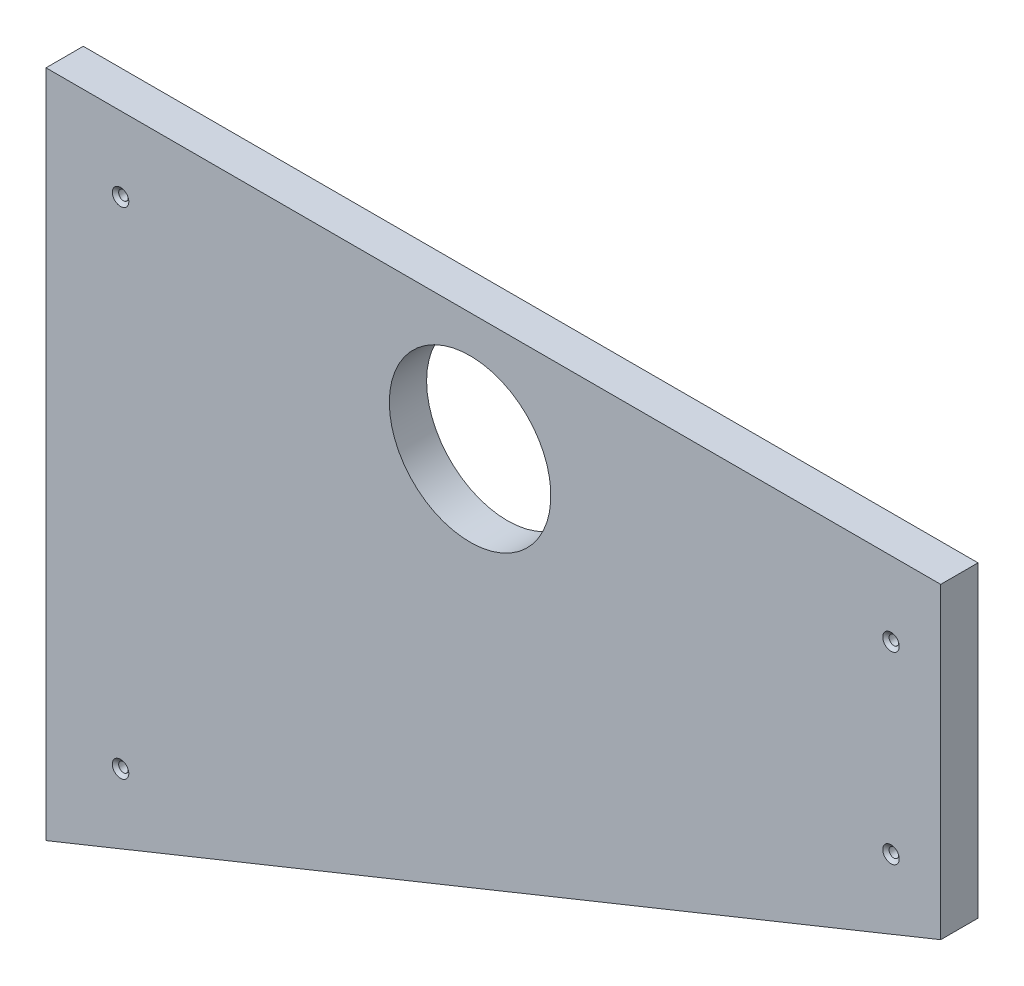
ISO-10303-21;
HEADER;
FILE_DESCRIPTION(('STEP AP214'),'2;1');
FILE_NAME('part.step','',(''),(''),'','','');
FILE_SCHEMA(('AUTOMOTIVE_DESIGN { 1 0 10303 214 1 1 1 1 }'));
ENDSEC;
DATA;
#1=APPLICATION_CONTEXT('core data for automotive mechanical design processes');
#2=APPLICATION_PROTOCOL_DEFINITION('international standard','automotive_design',2000,#1);
#3=PRODUCT_CONTEXT('',#1,'mechanical');
#4=PRODUCT('Part','Part','',(#3));
#5=PRODUCT_RELATED_PRODUCT_CATEGORY('part','',(#4));
#6=PRODUCT_DEFINITION_FORMATION('','',#4);
#7=PRODUCT_DEFINITION_CONTEXT('part definition',#1,'design');
#8=PRODUCT_DEFINITION('design','',#6,#7);
#9=PRODUCT_DEFINITION_SHAPE('','',#8);
#10=(LENGTH_UNIT() NAMED_UNIT(*) SI_UNIT(.MILLI.,.METRE.));
#11=(NAMED_UNIT(*) PLANE_ANGLE_UNIT() SI_UNIT($,.RADIAN.));
#12=(NAMED_UNIT(*) SI_UNIT($,.STERADIAN.) SOLID_ANGLE_UNIT());
#13=UNCERTAINTY_MEASURE_WITH_UNIT(LENGTH_MEASURE(1.E-05),#10,'distance_accuracy_value','');
#14=(GEOMETRIC_REPRESENTATION_CONTEXT(3) GLOBAL_UNCERTAINTY_ASSIGNED_CONTEXT((#13)) GLOBAL_UNIT_ASSIGNED_CONTEXT((#10,
#11,#12)) REPRESENTATION_CONTEXT('',''));
#15=CARTESIAN_POINT('',(0.,0.,0.));
#16=DIRECTION('',(0.,0.,1.));
#17=DIRECTION('',(1.,0.,0.));
#18=AXIS2_PLACEMENT_3D('',#15,#16,#17);
#19=CARTESIAN_POINT('',(3140.70999999981,6983.72999014018,-19.05));
#20=DIRECTION('',(0.,-1.,0.));
#21=DIRECTION('',(1.,0.,0.));
#22=AXIS2_PLACEMENT_3D('',#19,#20,#21);
#23=PLANE('',#22);
#24=DIRECTION('',(-1.,0.,0.));
#25=VECTOR('',#24,1.);
#26=CARTESIAN_POINT('',(3140.70999999981,6983.72999014018,0.));
#27=LINE('',#26,#25);
#28=CARTESIAN_POINT('',(3140.70999999981,6983.72999014018,0.));
#29=VERTEX_POINT('',#28);
#30=CARTESIAN_POINT('',(2683.50999999981,6983.72999014018,0.));
#31=VERTEX_POINT('',#30);
#32=EDGE_CURVE('E103',#29,#31,#27,.T.);
#33=ORIENTED_EDGE('',*,*,#32,.F.);
#34=DIRECTION('',(0.,0.,1.));
#35=VECTOR('',#34,1.);
#36=CARTESIAN_POINT('',(3140.70999999981,6983.72999014018,-19.05));
#37=LINE('',#36,#35);
#38=CARTESIAN_POINT('',(3140.70999999981,6983.72999014018,-19.05));
#39=VERTEX_POINT('',#38);
#40=EDGE_CURVE('E102',#39,#29,#37,.T.);
#41=ORIENTED_EDGE('',*,*,#40,.F.);
#42=DIRECTION('',(-1.,0.,0.));
#43=VECTOR('',#42,1.);
#44=CARTESIAN_POINT('',(3140.70999999981,6983.72999014018,-19.05));
#45=LINE('',#44,#43);
#46=CARTESIAN_POINT('',(2683.50999999981,6983.72999014018,-19.05));
#47=VERTEX_POINT('',#46);
#48=EDGE_CURVE('E96',#39,#47,#45,.T.);
#49=ORIENTED_EDGE('',*,*,#48,.T.);
#50=DIRECTION('',(0.,0.,1.));
#51=VECTOR('',#50,1.);
#52=CARTESIAN_POINT('',(2683.50999999981,6983.72999014018,-19.05));
#53=LINE('',#52,#51);
#54=EDGE_CURVE('E11',#47,#31,#53,.T.);
#55=ORIENTED_EDGE('',*,*,#54,.T.);
#56=EDGE_LOOP('',(#33,#41,#49,#55));
#57=FACE_BOUND('',#56,.T.);
#58=ADVANCED_FACE('F39',(#57),#23,.F.);
#59=CARTESIAN_POINT('',(2683.50999999981,6983.72999014018,-19.05));
#60=DIRECTION('',(1.,0.,0.));
#61=DIRECTION('',(0.,0.,1.));
#62=AXIS2_PLACEMENT_3D('',#59,#60,#61);
#63=PLANE('',#62);
#64=DIRECTION('',(0.,-1.,0.));
#65=VECTOR('',#64,1.);
#66=CARTESIAN_POINT('',(2683.50999999981,6983.72999014018,0.));
#67=LINE('',#66,#65);
#68=CARTESIAN_POINT('',(2683.50999999981,6641.74188684795,0.));
#69=VERTEX_POINT('',#68);
#70=EDGE_CURVE('E105',#31,#69,#67,.T.);
#71=ORIENTED_EDGE('',*,*,#70,.F.);
#72=ORIENTED_EDGE('',*,*,#54,.F.);
#73=DIRECTION('',(0.,-1.,0.));
#74=VECTOR('',#73,1.);
#75=CARTESIAN_POINT('',(2683.50999999981,6983.72999014018,-19.05));
#76=LINE('',#75,#74);
#77=CARTESIAN_POINT('',(2683.50999999981,6641.74188684795,-19.05));
#78=VERTEX_POINT('',#77);
#79=EDGE_CURVE('E80',#47,#78,#76,.T.);
#80=ORIENTED_EDGE('',*,*,#79,.T.);
#81=DIRECTION('',(0.,0.,1.));
#82=VECTOR('',#81,1.);
#83=CARTESIAN_POINT('',(2683.50999999981,6641.74188684795,-19.05));
#84=LINE('',#83,#82);
#85=EDGE_CURVE('E47',#78,#69,#84,.T.);
#86=ORIENTED_EDGE('',*,*,#85,.T.);
#87=EDGE_LOOP('',(#71,#72,#80,#86));
#88=FACE_BOUND('',#87,.T.);
#89=ADVANCED_FACE('F94',(#88),#63,.F.);
#90=CARTESIAN_POINT('',(2683.50999999981,6641.74188684795,-19.05));
#91=DIRECTION('',(-0.374606593415956,0.927183854566769,0.));
#92=DIRECTION('',(-0.92718385456677,-0.374606593415956,0.));
#93=AXIS2_PLACEMENT_3D('',#90,#91,#92);
#94=PLANE('',#93);
#95=DIRECTION('',(0.927183854566769,0.374606593415956,0.));
#96=VECTOR('',#95,1.);
#97=CARTESIAN_POINT('',(2683.50999999981,6641.74188684795,0.));
#98=LINE('',#97,#96);
#99=CARTESIAN_POINT('',(3140.70999999981,6826.46267729981,0.));
#100=VERTEX_POINT('',#99);
#101=EDGE_CURVE('E90',#69,#100,#98,.T.);
#102=ORIENTED_EDGE('',*,*,#101,.F.);
#103=ORIENTED_EDGE('',*,*,#85,.F.);
#104=DIRECTION('',(0.927183854566769,0.374606593415956,0.));
#105=VECTOR('',#104,1.);
#106=CARTESIAN_POINT('',(2683.50999999981,6641.74188684795,-19.05));
#107=LINE('',#106,#105);
#108=CARTESIAN_POINT('',(3140.70999999981,6826.46267729981,-19.05));
#109=VERTEX_POINT('',#108);
#110=EDGE_CURVE('E83',#78,#109,#107,.T.);
#111=ORIENTED_EDGE('',*,*,#110,.T.);
#112=DIRECTION('',(0.,0.,1.));
#113=VECTOR('',#112,1.);
#114=CARTESIAN_POINT('',(3140.70999999981,6826.46267729981,-19.05));
#115=LINE('',#114,#113);
#116=EDGE_CURVE('E93',#109,#100,#115,.T.);
#117=ORIENTED_EDGE('',*,*,#116,.T.);
#118=EDGE_LOOP('',(#102,#103,#111,#117));
#119=FACE_BOUND('',#118,.T.);
#120=ADVANCED_FACE('F89',(#119),#94,.F.);
#121=CARTESIAN_POINT('',(3140.70999999981,6826.46267729981,-19.05));
#122=DIRECTION('',(-1.,0.,0.));
#123=DIRECTION('',(0.,0.,-1.));
#124=AXIS2_PLACEMENT_3D('',#121,#122,#123);
#125=PLANE('',#124);
#126=DIRECTION('',(0.,1.,0.));
#127=VECTOR('',#126,1.);
#128=CARTESIAN_POINT('',(3140.70999999981,6826.46267729981,0.));
#129=LINE('',#128,#127);
#130=EDGE_CURVE('E69',#100,#29,#129,.T.);
#131=ORIENTED_EDGE('',*,*,#130,.F.);
#132=ORIENTED_EDGE('',*,*,#116,.F.);
#133=DIRECTION('',(0.,1.,0.));
#134=VECTOR('',#133,1.);
#135=CARTESIAN_POINT('',(3140.70999999981,6826.46267729981,-19.05));
#136=LINE('',#135,#134);
#137=EDGE_CURVE('E55',#109,#39,#136,.T.);
#138=ORIENTED_EDGE('',*,*,#137,.T.);
#139=ORIENTED_EDGE('',*,*,#40,.T.);
#140=EDGE_LOOP('',(#131,#132,#138,#139));
#141=FACE_BOUND('',#140,.T.);
#142=ADVANCED_FACE('F115',(#141),#125,.F.);
#143=CARTESIAN_POINT('',(0.,0.,-19.05));
#144=DIRECTION('',(0.,0.,-1.));
#145=DIRECTION('',(1.,0.,0.));
#146=AXIS2_PLACEMENT_3D('',#143,#144,#145);
#147=PLANE('',#146);
#148=CARTESIAN_POINT('',(2900.21804025707,6923.40499014018,-19.05));
#149=DIRECTION('',(0.,0.,1.));
#150=DIRECTION('',(1.,0.,0.));
#151=AXIS2_PLACEMENT_3D('',#148,#149,#150);
#152=CIRCLE('',#151,41.2750000000001);
#153=CARTESIAN_POINT('',(2941.49304025707,6923.40499014018,-19.05));
#154=VERTEX_POINT('',#153);
#155=EDGE_CURVE('E259',#154,#154,#152,.T.);
#156=ORIENTED_EDGE('',*,*,#155,.T.);
#157=EDGE_LOOP('',(#156));
#158=FACE_BOUND('',#157,.T.);
#159=CARTESIAN_POINT('',(2721.61000000056,6692.54189162913,-19.05));
#160=DIRECTION('',(0.,0.,-1.));
#161=DIRECTION('',(-1.,0.,0.));
#162=AXIS2_PLACEMENT_3D('',#159,#160,#161);
#163=CIRCLE('',#162,2.45745000000008);
#164=CARTESIAN_POINT('',(2719.15255000056,6692.54189162913,-19.05));
#165=VERTEX_POINT('',#164);
#166=EDGE_CURVE('E272',#165,#165,#163,.T.);
#167=ORIENTED_EDGE('',*,*,#166,.F.);
#168=EDGE_LOOP('',(#167));
#169=FACE_BOUND('',#168,.T.);
#170=CARTESIAN_POINT('',(2721.61000000058,6945.62999492127,-19.05));
#171=DIRECTION('',(0.,0.,-1.));
#172=DIRECTION('',(-1.,0.,0.));
#173=AXIS2_PLACEMENT_3D('',#170,#171,#172);
#174=CIRCLE('',#173,2.45745000000008);
#175=CARTESIAN_POINT('',(2719.15255000058,6945.62999492127,-19.05));
#176=VERTEX_POINT('',#175);
#177=EDGE_CURVE('E281',#176,#176,#174,.T.);
#178=ORIENTED_EDGE('',*,*,#177,.F.);
#179=EDGE_LOOP('',(#178));
#180=FACE_BOUND('',#179,.T.);
#181=CARTESIAN_POINT('',(3115.31000000058,6945.62999492124,-19.05));
#182=DIRECTION('',(0.,0.,-1.));
#183=DIRECTION('',(-1.,0.,0.));
#184=AXIS2_PLACEMENT_3D('',#181,#182,#183);
#185=CIRCLE('',#184,2.45745000000008);
#186=CARTESIAN_POINT('',(3112.85255000058,6945.62999492124,-19.05));
#187=VERTEX_POINT('',#186);
#188=EDGE_CURVE('E290',#187,#187,#185,.T.);
#189=ORIENTED_EDGE('',*,*,#188,.F.);
#190=EDGE_LOOP('',(#189));
#191=FACE_BOUND('',#190,.T.);
#192=CARTESIAN_POINT('',(3115.31000000057,6851.60701674041,-19.05));
#193=DIRECTION('',(0.,0.,-1.));
#194=DIRECTION('',(-1.,0.,0.));
#195=AXIS2_PLACEMENT_3D('',#192,#193,#194);
#196=CIRCLE('',#195,2.45745000000008);
#197=CARTESIAN_POINT('',(3112.85255000057,6851.60701674041,-19.05));
#198=VERTEX_POINT('',#197);
#199=EDGE_CURVE('E106',#198,#198,#196,.T.);
#200=ORIENTED_EDGE('',*,*,#199,.F.);
#201=EDGE_LOOP('',(#200));
#202=FACE_BOUND('',#201,.T.);
#203=ORIENTED_EDGE('',*,*,#48,.F.);
#204=ORIENTED_EDGE('',*,*,#137,.F.);
#205=ORIENTED_EDGE('',*,*,#110,.F.);
#206=ORIENTED_EDGE('',*,*,#79,.F.);
#207=EDGE_LOOP('',(#203,#204,#205,#206));
#208=FACE_BOUND('',#207,.T.);
#209=ADVANCED_FACE('F85',(#158,#169,#180,#191,#202,#208),#147,.T.);
#210=CARTESIAN_POINT('',(0.,0.,0.));
#211=DIRECTION('',(0.,0.,-1.));
#212=DIRECTION('',(1.,0.,0.));
#213=AXIS2_PLACEMENT_3D('',#210,#211,#212);
#214=PLANE('',#213);
#215=CARTESIAN_POINT('',(2900.21804025707,6923.40499014018,0.));
#216=DIRECTION('',(0.,0.,-1.));
#217=DIRECTION('',(-1.,0.,0.));
#218=AXIS2_PLACEMENT_3D('',#215,#216,#217);
#219=CIRCLE('',#218,41.2750000000001);
#220=CARTESIAN_POINT('',(2858.94304025707,6923.40499014018,0.));
#221=VERTEX_POINT('',#220);
#222=EDGE_CURVE('E262',#221,#221,#219,.T.);
#223=ORIENTED_EDGE('',*,*,#222,.T.);
#224=EDGE_LOOP('',(#223));
#225=FACE_BOUND('',#224,.T.);
#226=CARTESIAN_POINT('',(2721.61000000056,6692.54189162913,0.));
#227=DIRECTION('',(0.,0.,-1.));
#228=DIRECTION('',(-1.,0.,0.));
#229=AXIS2_PLACEMENT_3D('',#226,#227,#228);
#230=CIRCLE('',#229,4.21639999999979);
#231=CARTESIAN_POINT('',(2717.39360000056,6692.54189162913,0.));
#232=VERTEX_POINT('',#231);
#233=EDGE_CURVE('E264',#232,#232,#230,.T.);
#234=ORIENTED_EDGE('',*,*,#233,.T.);
#235=EDGE_LOOP('',(#234));
#236=FACE_BOUND('',#235,.T.);
#237=CARTESIAN_POINT('',(2721.61000000058,6945.62999492127,0.));
#238=DIRECTION('',(0.,0.,-1.));
#239=DIRECTION('',(-1.,0.,0.));
#240=AXIS2_PLACEMENT_3D('',#237,#238,#239);
#241=CIRCLE('',#240,4.21639999999979);
#242=CARTESIAN_POINT('',(2717.39360000058,6945.62999492127,0.));
#243=VERTEX_POINT('',#242);
#244=EDGE_CURVE('E275',#243,#243,#241,.T.);
#245=ORIENTED_EDGE('',*,*,#244,.T.);
#246=EDGE_LOOP('',(#245));
#247=FACE_BOUND('',#246,.T.);
#248=CARTESIAN_POINT('',(3115.31000000058,6945.62999492124,0.));
#249=DIRECTION('',(0.,0.,-1.));
#250=DIRECTION('',(-1.,0.,0.));
#251=AXIS2_PLACEMENT_3D('',#248,#249,#250);
#252=CIRCLE('',#251,4.21639999999979);
#253=CARTESIAN_POINT('',(3111.09360000058,6945.62999492124,0.));
#254=VERTEX_POINT('',#253);
#255=EDGE_CURVE('E284',#254,#254,#252,.T.);
#256=ORIENTED_EDGE('',*,*,#255,.T.);
#257=EDGE_LOOP('',(#256));
#258=FACE_BOUND('',#257,.T.);
#259=CARTESIAN_POINT('',(3115.31000000057,6851.60701674041,0.));
#260=DIRECTION('',(0.,0.,-1.));
#261=DIRECTION('',(-1.,0.,0.));
#262=AXIS2_PLACEMENT_3D('',#259,#260,#261);
#263=CIRCLE('',#262,4.21639999999979);
#264=CARTESIAN_POINT('',(3111.09360000057,6851.60701674041,0.));
#265=VERTEX_POINT('',#264);
#266=EDGE_CURVE('E293',#265,#265,#263,.T.);
#267=ORIENTED_EDGE('',*,*,#266,.T.);
#268=EDGE_LOOP('',(#267));
#269=FACE_BOUND('',#268,.T.);
#270=ORIENTED_EDGE('',*,*,#32,.T.);
#271=ORIENTED_EDGE('',*,*,#70,.T.);
#272=ORIENTED_EDGE('',*,*,#101,.T.);
#273=ORIENTED_EDGE('',*,*,#130,.T.);
#274=EDGE_LOOP('',(#270,#271,#272,#273));
#275=FACE_BOUND('',#274,.T.);
#276=ADVANCED_FACE('F111',(#225,#236,#247,#258,#269,#275),#214,.F.);
#277=CARTESIAN_POINT('',(3115.31000000057,6851.60701674041,0.));
#278=DIRECTION('',(0.,0.,1.));
#279=DIRECTION('',(-1.,0.,0.));
#280=AXIS2_PLACEMENT_3D('',#277,#278,#279);
#281=CYLINDRICAL_SURFACE('',#280,2.45745000000008);
#282=ORIENTED_EDGE('',*,*,#199,.T.);
#283=EDGE_LOOP('',(#282));
#284=FACE_BOUND('',#283,.T.);
#285=CARTESIAN_POINT('',(3115.31000000057,6851.60701674041,-1.47593429625929));
#286=DIRECTION('',(0.,0.,-1.));
#287=DIRECTION('',(-1.,0.,0.));
#288=AXIS2_PLACEMENT_3D('',#285,#286,#287);
#289=CIRCLE('',#288,2.45745000000008);
#290=CARTESIAN_POINT('',(3112.85255000057,6851.60701674041,-1.47593429625929));
#291=VERTEX_POINT('',#290);
#292=EDGE_CURVE('E296',#291,#291,#289,.T.);
#293=ORIENTED_EDGE('',*,*,#292,.F.);
#294=EDGE_LOOP('',(#293));
#295=FACE_BOUND('',#294,.T.);
#296=ADVANCED_FACE('F155',(#284,#295),#281,.F.);
#297=CARTESIAN_POINT('',(3115.31000000057,6851.60701674041,0.));
#298=DIRECTION('',(0.,0.,1.));
#299=DIRECTION('',(-1.,0.,0.));
#300=AXIS2_PLACEMENT_3D('',#297,#298,#299);
#301=CONICAL_SURFACE('',#300,4.21639999999979,0.872664625997076);
#302=ORIENTED_EDGE('',*,*,#292,.T.);
#303=EDGE_LOOP('',(#302));
#304=FACE_BOUND('',#303,.T.);
#305=ORIENTED_EDGE('',*,*,#266,.F.);
#306=EDGE_LOOP('',(#305));
#307=FACE_BOUND('',#306,.T.);
#308=ADVANCED_FACE('F164',(#304,#307),#301,.F.);
#309=CARTESIAN_POINT('',(3115.31000000058,6945.62999492124,0.));
#310=DIRECTION('',(0.,0.,1.));
#311=DIRECTION('',(-1.,0.,0.));
#312=AXIS2_PLACEMENT_3D('',#309,#310,#311);
#313=CYLINDRICAL_SURFACE('',#312,2.45745000000008);
#314=ORIENTED_EDGE('',*,*,#188,.T.);
#315=EDGE_LOOP('',(#314));
#316=FACE_BOUND('',#315,.T.);
#317=CARTESIAN_POINT('',(3115.31000000058,6945.62999492124,-1.47593429625929));
#318=DIRECTION('',(0.,0.,-1.));
#319=DIRECTION('',(-1.,0.,0.));
#320=AXIS2_PLACEMENT_3D('',#317,#318,#319);
#321=CIRCLE('',#320,2.45745000000008);
#322=CARTESIAN_POINT('',(3112.85255000058,6945.62999492124,-1.47593429625929));
#323=VERTEX_POINT('',#322);
#324=EDGE_CURVE('E287',#323,#323,#321,.T.);
#325=ORIENTED_EDGE('',*,*,#324,.F.);
#326=EDGE_LOOP('',(#325));
#327=FACE_BOUND('',#326,.T.);
#328=ADVANCED_FACE('F175',(#316,#327),#313,.F.);
#329=CARTESIAN_POINT('',(3115.31000000058,6945.62999492124,0.));
#330=DIRECTION('',(0.,0.,1.));
#331=DIRECTION('',(-1.,0.,0.));
#332=AXIS2_PLACEMENT_3D('',#329,#330,#331);
#333=CONICAL_SURFACE('',#332,4.21639999999979,0.872664625997076);
#334=ORIENTED_EDGE('',*,*,#324,.T.);
#335=EDGE_LOOP('',(#334));
#336=FACE_BOUND('',#335,.T.);
#337=ORIENTED_EDGE('',*,*,#255,.F.);
#338=EDGE_LOOP('',(#337));
#339=FACE_BOUND('',#338,.T.);
#340=ADVANCED_FACE('F186',(#336,#339),#333,.F.);
#341=CARTESIAN_POINT('',(2721.61000000058,6945.62999492127,0.));
#342=DIRECTION('',(0.,0.,1.));
#343=DIRECTION('',(-1.,0.,0.));
#344=AXIS2_PLACEMENT_3D('',#341,#342,#343);
#345=CYLINDRICAL_SURFACE('',#344,2.45745000000008);
#346=ORIENTED_EDGE('',*,*,#177,.T.);
#347=EDGE_LOOP('',(#346));
#348=FACE_BOUND('',#347,.T.);
#349=CARTESIAN_POINT('',(2721.61000000058,6945.62999492127,-1.47593429625929));
#350=DIRECTION('',(0.,0.,-1.));
#351=DIRECTION('',(-1.,0.,0.));
#352=AXIS2_PLACEMENT_3D('',#349,#350,#351);
#353=CIRCLE('',#352,2.45745000000008);
#354=CARTESIAN_POINT('',(2719.15255000058,6945.62999492127,-1.47593429625929));
#355=VERTEX_POINT('',#354);
#356=EDGE_CURVE('E278',#355,#355,#353,.T.);
#357=ORIENTED_EDGE('',*,*,#356,.F.);
#358=EDGE_LOOP('',(#357));
#359=FACE_BOUND('',#358,.T.);
#360=ADVANCED_FACE('F197',(#348,#359),#345,.F.);
#361=CARTESIAN_POINT('',(2721.61000000058,6945.62999492127,0.));
#362=DIRECTION('',(0.,0.,1.));
#363=DIRECTION('',(-1.,0.,0.));
#364=AXIS2_PLACEMENT_3D('',#361,#362,#363);
#365=CONICAL_SURFACE('',#364,4.21639999999979,0.872664625997076);
#366=ORIENTED_EDGE('',*,*,#356,.T.);
#367=EDGE_LOOP('',(#366));
#368=FACE_BOUND('',#367,.T.);
#369=ORIENTED_EDGE('',*,*,#244,.F.);
#370=EDGE_LOOP('',(#369));
#371=FACE_BOUND('',#370,.T.);
#372=ADVANCED_FACE('F208',(#368,#371),#365,.F.);
#373=CARTESIAN_POINT('',(2721.61000000056,6692.54189162913,0.));
#374=DIRECTION('',(0.,0.,1.));
#375=DIRECTION('',(-1.,0.,0.));
#376=AXIS2_PLACEMENT_3D('',#373,#374,#375);
#377=CYLINDRICAL_SURFACE('',#376,2.45745000000008);
#378=ORIENTED_EDGE('',*,*,#166,.T.);
#379=EDGE_LOOP('',(#378));
#380=FACE_BOUND('',#379,.T.);
#381=CARTESIAN_POINT('',(2721.61000000056,6692.54189162913,-1.47593429625929));
#382=DIRECTION('',(0.,0.,-1.));
#383=DIRECTION('',(-1.,0.,0.));
#384=AXIS2_PLACEMENT_3D('',#381,#382,#383);
#385=CIRCLE('',#384,2.45745000000008);
#386=CARTESIAN_POINT('',(2719.15255000056,6692.54189162913,-1.47593429625929));
#387=VERTEX_POINT('',#386);
#388=EDGE_CURVE('E269',#387,#387,#385,.T.);
#389=ORIENTED_EDGE('',*,*,#388,.F.);
#390=EDGE_LOOP('',(#389));
#391=FACE_BOUND('',#390,.T.);
#392=ADVANCED_FACE('F219',(#380,#391),#377,.F.);
#393=CARTESIAN_POINT('',(2721.61000000056,6692.54189162913,0.));
#394=DIRECTION('',(0.,0.,1.));
#395=DIRECTION('',(-1.,0.,0.));
#396=AXIS2_PLACEMENT_3D('',#393,#394,#395);
#397=CONICAL_SURFACE('',#396,4.21639999999979,0.872664625997076);
#398=ORIENTED_EDGE('',*,*,#388,.T.);
#399=EDGE_LOOP('',(#398));
#400=FACE_BOUND('',#399,.T.);
#401=ORIENTED_EDGE('',*,*,#233,.F.);
#402=EDGE_LOOP('',(#401));
#403=FACE_BOUND('',#402,.T.);
#404=ADVANCED_FACE('F230',(#400,#403),#397,.F.);
#405=CARTESIAN_POINT('',(2900.21804025707,6923.40499014018,-38.1));
#406=DIRECTION('',(0.,0.,1.));
#407=DIRECTION('',(-1.,0.,0.));
#408=AXIS2_PLACEMENT_3D('',#405,#406,#407);
#409=CYLINDRICAL_SURFACE('',#408,41.2750000000001);
#410=ORIENTED_EDGE('',*,*,#155,.F.);
#411=EDGE_LOOP('',(#410));
#412=FACE_BOUND('',#411,.T.);
#413=ORIENTED_EDGE('',*,*,#222,.F.);
#414=EDGE_LOOP('',(#413));
#415=FACE_BOUND('',#414,.T.);
#416=ADVANCED_FACE('F241',(#412,#415),#409,.F.);
#417=CLOSED_SHELL('',(#58,#89,#120,#142,#209,#276,#296,#308,#328,#340,#360,#372,#392,#404,#416));
#418=MANIFOLD_SOLID_BREP('B2',#417);
#419=ADVANCED_BREP_SHAPE_REPRESENTATION('',(#18,#418),#14);
#420=SHAPE_DEFINITION_REPRESENTATION(#9,#419);
ENDSEC;
END-ISO-10303-21;
